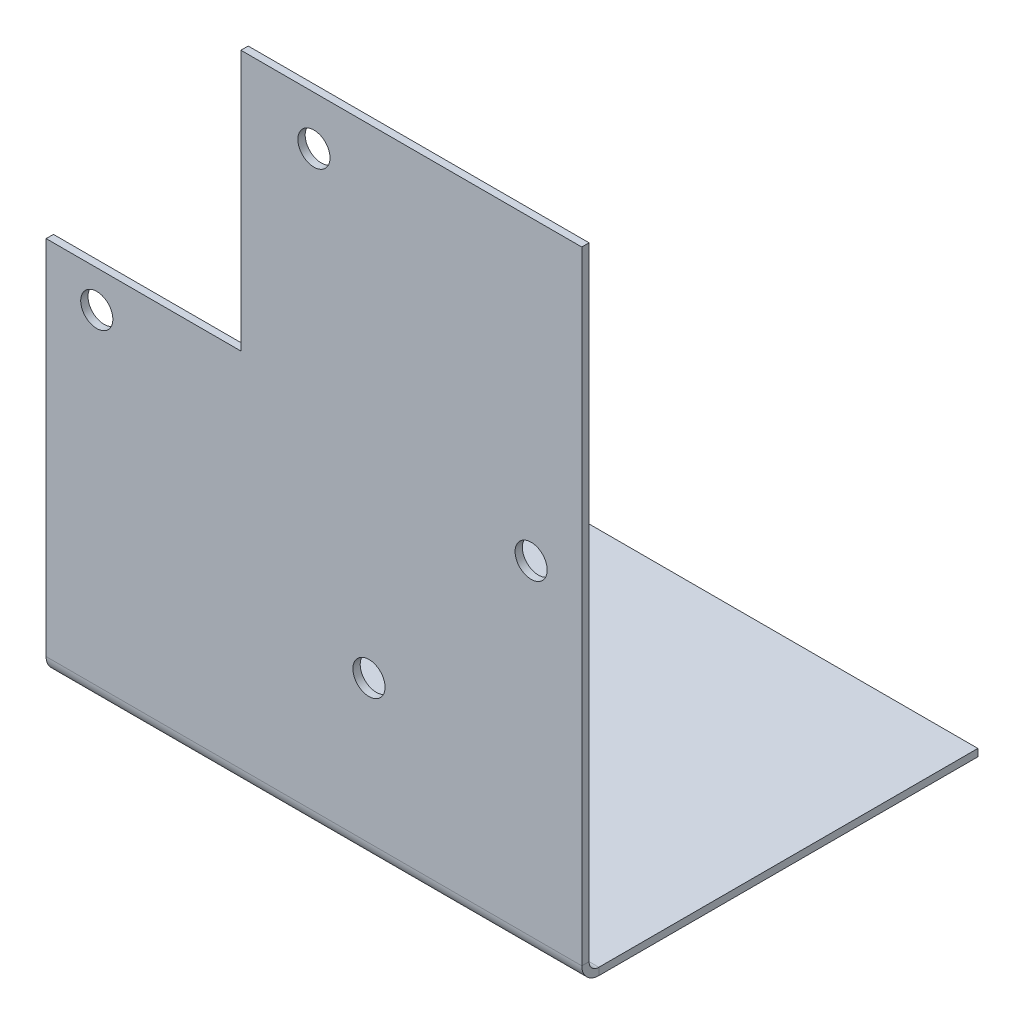
ISO-10303-21;
HEADER;
FILE_DESCRIPTION(('STEP AP214'),'2;1');
FILE_NAME('part.step','',(''),(''),'','','');
FILE_SCHEMA(('AUTOMOTIVE_DESIGN { 1 0 10303 214 1 1 1 1 }'));
ENDSEC;
DATA;
#1=APPLICATION_CONTEXT('core data for automotive mechanical design processes');
#2=APPLICATION_PROTOCOL_DEFINITION('international standard','automotive_design',2000,#1);
#3=PRODUCT_CONTEXT('',#1,'mechanical');
#4=PRODUCT('Part','Part','',(#3));
#5=PRODUCT_RELATED_PRODUCT_CATEGORY('part','',(#4));
#6=PRODUCT_DEFINITION_FORMATION('','',#4);
#7=PRODUCT_DEFINITION_CONTEXT('part definition',#1,'design');
#8=PRODUCT_DEFINITION('design','',#6,#7);
#9=PRODUCT_DEFINITION_SHAPE('','',#8);
#10=(LENGTH_UNIT() NAMED_UNIT(*) SI_UNIT(.MILLI.,.METRE.));
#11=(NAMED_UNIT(*) PLANE_ANGLE_UNIT() SI_UNIT($,.RADIAN.));
#12=(NAMED_UNIT(*) SI_UNIT($,.STERADIAN.) SOLID_ANGLE_UNIT());
#13=UNCERTAINTY_MEASURE_WITH_UNIT(LENGTH_MEASURE(1.E-05),#10,'distance_accuracy_value','');
#14=(GEOMETRIC_REPRESENTATION_CONTEXT(3) GLOBAL_UNCERTAINTY_ASSIGNED_CONTEXT((#13)) GLOBAL_UNIT_ASSIGNED_CONTEXT((#10,
#11,#12)) REPRESENTATION_CONTEXT('',''));
#15=CARTESIAN_POINT('',(0.,0.,0.));
#16=DIRECTION('',(0.,0.,1.));
#17=DIRECTION('',(1.,0.,0.));
#18=AXIS2_PLACEMENT_3D('',#15,#16,#17);
#19=CARTESIAN_POINT('',(-55.,-26.3401550506575,130.159844949343));
#20=DIRECTION('',(-1.,0.,0.));
#21=DIRECTION('',(0.,0.,-1.));
#22=AXIS2_PLACEMENT_3D('',#19,#20,#21);
#23=PLANE('',#22);
#24=DIRECTION('',(0.,0.,-1.));
#25=VECTOR('',#24,1.);
#26=CARTESIAN_POINT('',(-55.,-26.3401550506575,130.159844949343));
#27=LINE('',#26,#25);
#28=CARTESIAN_POINT('',(-55.,-26.340155050657,-2.00000000000001));
#29=VERTEX_POINT('',#28);
#30=CARTESIAN_POINT('',(-55.,-26.3401550506567,-79.840155050657));
#31=VERTEX_POINT('',#30);
#32=EDGE_CURVE('E171',#29,#31,#27,.T.);
#33=ORIENTED_EDGE('',*,*,#32,.F.);
#34=DIRECTION('',(0.,1.,0.));
#35=VECTOR('',#34,1.);
#36=CARTESIAN_POINT('',(-55.,-26.3401550506561,-2.00000000000001));
#37=LINE('',#36,#35);
#38=CARTESIAN_POINT('',(-55.,-24.840155050657,-2.00000000000001));
#39=VERTEX_POINT('',#38);
#40=EDGE_CURVE('E12',#29,#39,#37,.T.);
#41=ORIENTED_EDGE('',*,*,#40,.T.);
#42=DIRECTION('',(0.,0.,1.));
#43=VECTOR('',#42,1.);
#44=CARTESIAN_POINT('',(-55.,-24.8401550506571,25.159844949343));
#45=LINE('',#44,#43);
#46=CARTESIAN_POINT('',(-55.,-24.8401550506567,-79.840155050657));
#47=VERTEX_POINT('',#46);
#48=EDGE_CURVE('E83',#39,#47,#45,.F.);
#49=ORIENTED_EDGE('',*,*,#48,.T.);
#50=DIRECTION('',(0.,-1.,0.));
#51=VECTOR('',#50,1.);
#52=CARTESIAN_POINT('',(-55.,-26.3401550506567,-79.840155050657));
#53=LINE('',#52,#51);
#54=EDGE_CURVE('E172',#47,#31,#53,.T.);
#55=ORIENTED_EDGE('',*,*,#54,.T.);
#56=EDGE_LOOP('',(#33,#41,#49,#55));
#57=FACE_BOUND('',#56,.T.);
#58=ADVANCED_FACE('F45',(#57),#23,.T.);
#59=CARTESIAN_POINT('',(55.,-26.3401550506575,130.159844949343));
#60=DIRECTION('',(1.,0.,0.));
#61=DIRECTION('',(0.,0.,1.));
#62=AXIS2_PLACEMENT_3D('',#59,#60,#61);
#63=PLANE('',#62);
#64=DIRECTION('',(0.,0.,1.));
#65=VECTOR('',#64,1.);
#66=CARTESIAN_POINT('',(55.,-24.8401550506571,25.159844949343));
#67=LINE('',#66,#65);
#68=CARTESIAN_POINT('',(55.,-24.8401550506567,-79.840155050657));
#69=VERTEX_POINT('',#68);
#70=CARTESIAN_POINT('',(54.9999999999999,-24.840155050657,-2.00000000000001));
#71=VERTEX_POINT('',#70);
#72=EDGE_CURVE('E175',#69,#71,#67,.T.);
#73=ORIENTED_EDGE('',*,*,#72,.T.);
#74=DIRECTION('',(0.,-1.,0.));
#75=VECTOR('',#74,1.);
#76=CARTESIAN_POINT('',(55.,-26.3401550506561,-2.00000000000001));
#77=LINE('',#76,#75);
#78=CARTESIAN_POINT('',(55.,-26.340155050657,-2.00000000000001));
#79=VERTEX_POINT('',#78);
#80=EDGE_CURVE('E143',#71,#79,#77,.T.);
#81=ORIENTED_EDGE('',*,*,#80,.T.);
#82=DIRECTION('',(0.,0.,1.));
#83=VECTOR('',#82,1.);
#84=CARTESIAN_POINT('',(55.,-26.3401550506575,130.159844949343));
#85=LINE('',#84,#83);
#86=CARTESIAN_POINT('',(55.,-26.3401550506567,-79.840155050657));
#87=VERTEX_POINT('',#86);
#88=EDGE_CURVE('E48',#87,#79,#85,.T.);
#89=ORIENTED_EDGE('',*,*,#88,.F.);
#90=DIRECTION('',(0.,-1.,0.));
#91=VECTOR('',#90,1.);
#92=CARTESIAN_POINT('',(55.,-26.3401550506567,-79.840155050657));
#93=LINE('',#92,#91);
#94=EDGE_CURVE('E70',#69,#87,#93,.T.);
#95=ORIENTED_EDGE('',*,*,#94,.F.);
#96=EDGE_LOOP('',(#73,#81,#89,#95));
#97=FACE_BOUND('',#96,.T.);
#98=ADVANCED_FACE('F257',(#97),#63,.T.);
#99=CARTESIAN_POINT('',(0.,-26.3401550506571,25.159844949343));
#100=DIRECTION('',(0.,-1.,0.));
#101=DIRECTION('',(1.,0.,0.));
#102=AXIS2_PLACEMENT_3D('',#99,#100,#101);
#103=PLANE('',#102);
#104=ORIENTED_EDGE('',*,*,#88,.T.);
#105=DIRECTION('',(-1.,0.,0.));
#106=VECTOR('',#105,1.);
#107=CARTESIAN_POINT('',(0.,-26.340155050657,-2.00000000000003));
#108=LINE('',#107,#106);
#109=EDGE_CURVE('E180',#79,#29,#108,.T.);
#110=ORIENTED_EDGE('',*,*,#109,.T.);
#111=ORIENTED_EDGE('',*,*,#32,.T.);
#112=DIRECTION('',(1.,0.,0.));
#113=VECTOR('',#112,1.);
#114=CARTESIAN_POINT('',(-55.,-26.3401550506567,-79.840155050657));
#115=LINE('',#114,#113);
#116=EDGE_CURVE('E174',#31,#87,#115,.T.);
#117=ORIENTED_EDGE('',*,*,#116,.T.);
#118=EDGE_LOOP('',(#104,#110,#111,#117));
#119=FACE_BOUND('',#118,.T.);
#120=ADVANCED_FACE('F255',(#119),#103,.T.);
#121=CARTESIAN_POINT('',(-55.,-26.3401550506567,-79.840155050657));
#122=DIRECTION('',(0.,0.,-1.));
#123=DIRECTION('',(1.,0.,0.));
#124=AXIS2_PLACEMENT_3D('',#121,#122,#123);
#125=PLANE('',#124);
#126=ORIENTED_EDGE('',*,*,#54,.F.);
#127=DIRECTION('',(1.,0.,0.));
#128=VECTOR('',#127,1.);
#129=CARTESIAN_POINT('',(0.,-24.8401550506567,-79.840155050657));
#130=LINE('',#129,#128);
#131=EDGE_CURVE('E167',#47,#69,#130,.T.);
#132=ORIENTED_EDGE('',*,*,#131,.T.);
#133=ORIENTED_EDGE('',*,*,#94,.T.);
#134=ORIENTED_EDGE('',*,*,#116,.F.);
#135=EDGE_LOOP('',(#126,#132,#133,#134));
#136=FACE_BOUND('',#135,.T.);
#137=ADVANCED_FACE('F258',(#136),#125,.T.);
#138=CARTESIAN_POINT('',(0.,-24.8401550506571,25.159844949343));
#139=DIRECTION('',(0.,-1.,0.));
#140=DIRECTION('',(1.,0.,0.));
#141=AXIS2_PLACEMENT_3D('',#138,#139,#140);
#142=PLANE('',#141);
#143=DIRECTION('',(-1.,0.,0.));
#144=VECTOR('',#143,1.);
#145=CARTESIAN_POINT('',(0.,-24.840155050657,-2.00000000000001));
#146=LINE('',#145,#144);
#147=EDGE_CURVE('E53',#71,#39,#146,.T.);
#148=ORIENTED_EDGE('',*,*,#147,.F.);
#149=ORIENTED_EDGE('',*,*,#72,.F.);
#150=ORIENTED_EDGE('',*,*,#131,.F.);
#151=ORIENTED_EDGE('',*,*,#48,.F.);
#152=EDGE_LOOP('',(#148,#149,#150,#151));
#153=FACE_BOUND('',#152,.T.);
#154=ADVANCED_FACE('F166',(#153),#142,.F.);
#155=CARTESIAN_POINT('',(11.3,6.50000000000001,1.5));
#156=DIRECTION('',(0.,0.,1.));
#157=DIRECTION('',(1.,0.,0.));
#158=AXIS2_PLACEMENT_3D('',#155,#156,#157);
#159=CYLINDRICAL_SURFACE('',#158,3.3);
#160=CARTESIAN_POINT('',(11.3,6.50000000000001,1.5));
#161=DIRECTION('',(0.,0.,1.));
#162=DIRECTION('',(1.,0.,0.));
#163=AXIS2_PLACEMENT_3D('',#160,#161,#162);
#164=CIRCLE('',#163,3.3);
#165=CARTESIAN_POINT('',(14.6,6.50000000000001,1.5));
#166=VERTEX_POINT('',#165);
#167=EDGE_CURVE('E191',#166,#166,#164,.T.);
#168=ORIENTED_EDGE('',*,*,#167,.T.);
#169=EDGE_LOOP('',(#168));
#170=FACE_BOUND('',#169,.T.);
#171=CARTESIAN_POINT('',(11.3,6.50000000000001,0.));
#172=DIRECTION('',(0.,0.,1.));
#173=DIRECTION('',(1.,0.,0.));
#174=AXIS2_PLACEMENT_3D('',#171,#172,#173);
#175=CIRCLE('',#174,3.3);
#176=CARTESIAN_POINT('',(14.6,6.50000000000001,0.));
#177=VERTEX_POINT('',#176);
#178=EDGE_CURVE('E226',#177,#177,#175,.T.);
#179=ORIENTED_EDGE('',*,*,#178,.F.);
#180=EDGE_LOOP('',(#179));
#181=FACE_BOUND('',#180,.T.);
#182=ADVANCED_FACE('F265',(#170,#181),#159,.F.);
#183=CARTESIAN_POINT('',(44.6,44.,1.5));
#184=DIRECTION('',(0.,0.,1.));
#185=DIRECTION('',(1.,0.,0.));
#186=AXIS2_PLACEMENT_3D('',#183,#184,#185);
#187=CYLINDRICAL_SURFACE('',#186,3.3);
#188=CARTESIAN_POINT('',(44.6,44.,1.5));
#189=DIRECTION('',(0.,0.,1.));
#190=DIRECTION('',(1.,0.,0.));
#191=AXIS2_PLACEMENT_3D('',#188,#189,#190);
#192=CIRCLE('',#191,3.3);
#193=CARTESIAN_POINT('',(47.9,44.,1.5));
#194=VERTEX_POINT('',#193);
#195=EDGE_CURVE('E194',#194,#194,#192,.T.);
#196=ORIENTED_EDGE('',*,*,#195,.T.);
#197=EDGE_LOOP('',(#196));
#198=FACE_BOUND('',#197,.T.);
#199=CARTESIAN_POINT('',(44.6,44.,0.));
#200=DIRECTION('',(0.,0.,1.));
#201=DIRECTION('',(1.,0.,0.));
#202=AXIS2_PLACEMENT_3D('',#199,#200,#201);
#203=CIRCLE('',#202,3.3);
#204=CARTESIAN_POINT('',(47.9,44.,0.));
#205=VERTEX_POINT('',#204);
#206=EDGE_CURVE('E229',#205,#205,#203,.T.);
#207=ORIENTED_EDGE('',*,*,#206,.F.);
#208=EDGE_LOOP('',(#207));
#209=FACE_BOUND('',#208,.T.);
#210=ADVANCED_FACE('F304',(#198,#209),#187,.F.);
#211=CARTESIAN_POINT('',(-44.6,44.,1.5));
#212=DIRECTION('',(0.,0.,1.));
#213=DIRECTION('',(1.,0.,0.));
#214=AXIS2_PLACEMENT_3D('',#211,#212,#213);
#215=CYLINDRICAL_SURFACE('',#214,3.3);
#216=CARTESIAN_POINT('',(-44.6,44.,1.5));
#217=DIRECTION('',(0.,0.,1.));
#218=DIRECTION('',(1.,0.,0.));
#219=AXIS2_PLACEMENT_3D('',#216,#217,#218);
#220=CIRCLE('',#219,3.3);
#221=CARTESIAN_POINT('',(-41.3,44.,1.5));
#222=VERTEX_POINT('',#221);
#223=EDGE_CURVE('E197',#222,#222,#220,.T.);
#224=ORIENTED_EDGE('',*,*,#223,.T.);
#225=EDGE_LOOP('',(#224));
#226=FACE_BOUND('',#225,.T.);
#227=CARTESIAN_POINT('',(-44.6,44.,0.));
#228=DIRECTION('',(0.,0.,1.));
#229=DIRECTION('',(1.,0.,0.));
#230=AXIS2_PLACEMENT_3D('',#227,#228,#229);
#231=CIRCLE('',#230,3.3);
#232=CARTESIAN_POINT('',(-41.3,44.,0.));
#233=VERTEX_POINT('',#232);
#234=EDGE_CURVE('E232',#233,#233,#231,.T.);
#235=ORIENTED_EDGE('',*,*,#234,.F.);
#236=EDGE_LOOP('',(#235));
#237=FACE_BOUND('',#236,.T.);
#238=ADVANCED_FACE('F316',(#226,#237),#215,.F.);
#239=CARTESIAN_POINT('',(0.,95.,1.5));
#240=DIRECTION('',(0.,0.,1.));
#241=DIRECTION('',(1.,0.,0.));
#242=AXIS2_PLACEMENT_3D('',#239,#240,#241);
#243=CYLINDRICAL_SURFACE('',#242,3.3);
#244=CARTESIAN_POINT('',(0.,95.,1.5));
#245=DIRECTION('',(0.,0.,1.));
#246=DIRECTION('',(1.,0.,0.));
#247=AXIS2_PLACEMENT_3D('',#244,#245,#246);
#248=CIRCLE('',#247,3.3);
#249=CARTESIAN_POINT('',(3.3,95.,1.5));
#250=VERTEX_POINT('',#249);
#251=EDGE_CURVE('E200',#250,#250,#248,.T.);
#252=ORIENTED_EDGE('',*,*,#251,.T.);
#253=EDGE_LOOP('',(#252));
#254=FACE_BOUND('',#253,.T.);
#255=CARTESIAN_POINT('',(0.,95.,0.));
#256=DIRECTION('',(0.,0.,1.));
#257=DIRECTION('',(1.,0.,0.));
#258=AXIS2_PLACEMENT_3D('',#255,#256,#257);
#259=CIRCLE('',#258,3.3);
#260=CARTESIAN_POINT('',(3.3,95.,0.));
#261=VERTEX_POINT('',#260);
#262=EDGE_CURVE('E235',#261,#261,#259,.T.);
#263=ORIENTED_EDGE('',*,*,#262,.F.);
#264=EDGE_LOOP('',(#263));
#265=FACE_BOUND('',#264,.T.);
#266=ADVANCED_FACE('F327',(#254,#265),#243,.F.);
#267=CARTESIAN_POINT('',(-55.,51.5,1.5));
#268=DIRECTION('',(0.,-1.,0.));
#269=DIRECTION('',(1.,0.,0.));
#270=AXIS2_PLACEMENT_3D('',#267,#268,#269);
#271=PLANE('',#270);
#272=DIRECTION('',(1.,0.,0.));
#273=VECTOR('',#272,1.);
#274=CARTESIAN_POINT('',(0.,51.5,0.));
#275=LINE('',#274,#273);
#276=CARTESIAN_POINT('',(-55.,51.5,0.));
#277=VERTEX_POINT('',#276);
#278=CARTESIAN_POINT('',(-15.,51.5,0.));
#279=VERTEX_POINT('',#278);
#280=EDGE_CURVE('E241',#277,#279,#275,.T.);
#281=ORIENTED_EDGE('',*,*,#280,.F.);
#282=DIRECTION('',(0.,0.,1.));
#283=VECTOR('',#282,1.);
#284=CARTESIAN_POINT('',(-55.,51.5,1.5));
#285=LINE('',#284,#283);
#286=CARTESIAN_POINT('',(-55.,51.5,1.5));
#287=VERTEX_POINT('',#286);
#288=EDGE_CURVE('E92',#277,#287,#285,.T.);
#289=ORIENTED_EDGE('',*,*,#288,.T.);
#290=DIRECTION('',(1.,0.,0.));
#291=VECTOR('',#290,1.);
#292=CARTESIAN_POINT('',(-55.,51.5,1.5));
#293=LINE('',#292,#291);
#294=CARTESIAN_POINT('',(-15.,51.5,1.5));
#295=VERTEX_POINT('',#294);
#296=EDGE_CURVE('E204',#287,#295,#293,.T.);
#297=ORIENTED_EDGE('',*,*,#296,.T.);
#298=DIRECTION('',(0.,0.,1.));
#299=VECTOR('',#298,1.);
#300=CARTESIAN_POINT('',(-15.,51.5,1.5));
#301=LINE('',#300,#299);
#302=EDGE_CURVE('E207',#279,#295,#301,.T.);
#303=ORIENTED_EDGE('',*,*,#302,.F.);
#304=EDGE_LOOP('',(#281,#289,#297,#303));
#305=FACE_BOUND('',#304,.T.);
#306=ADVANCED_FACE('F338',(#305),#271,.F.);
#307=CARTESIAN_POINT('',(-15.,51.5,1.5));
#308=DIRECTION('',(1.,0.,0.));
#309=DIRECTION('',(0.,1.,0.));
#310=AXIS2_PLACEMENT_3D('',#307,#308,#309);
#311=PLANE('',#310);
#312=DIRECTION('',(0.,0.,1.));
#313=VECTOR('',#312,1.);
#314=CARTESIAN_POINT('',(-15.,105.,1.5));
#315=LINE('',#314,#313);
#316=CARTESIAN_POINT('',(-15.,105.,0.));
#317=VERTEX_POINT('',#316);
#318=CARTESIAN_POINT('',(-15.,105.,1.5));
#319=VERTEX_POINT('',#318);
#320=EDGE_CURVE('E215',#317,#319,#315,.T.);
#321=ORIENTED_EDGE('',*,*,#320,.F.);
#322=DIRECTION('',(0.,1.,0.));
#323=VECTOR('',#322,1.);
#324=CARTESIAN_POINT('',(-15.,0.,0.));
#325=LINE('',#324,#323);
#326=EDGE_CURVE('E244',#279,#317,#325,.T.);
#327=ORIENTED_EDGE('',*,*,#326,.F.);
#328=ORIENTED_EDGE('',*,*,#302,.T.);
#329=DIRECTION('',(0.,1.,0.));
#330=VECTOR('',#329,1.);
#331=CARTESIAN_POINT('',(-15.,51.5,1.5));
#332=LINE('',#331,#330);
#333=EDGE_CURVE('E209',#295,#319,#332,.T.);
#334=ORIENTED_EDGE('',*,*,#333,.T.);
#335=EDGE_LOOP('',(#321,#327,#328,#334));
#336=FACE_BOUND('',#335,.T.);
#337=ADVANCED_FACE('F349',(#336),#311,.F.);
#338=CARTESIAN_POINT('',(-55.,105.,1.5));
#339=DIRECTION('',(0.,1.,0.));
#340=DIRECTION('',(-1.,0.,0.));
#341=AXIS2_PLACEMENT_3D('',#338,#339,#340);
#342=PLANE('',#341);
#343=DIRECTION('',(0.,0.,1.));
#344=VECTOR('',#343,1.);
#345=CARTESIAN_POINT('',(55.,105.,1.5));
#346=LINE('',#345,#344);
#347=CARTESIAN_POINT('',(55.,105.,0.));
#348=VERTEX_POINT('',#347);
#349=CARTESIAN_POINT('',(55.,105.,1.5));
#350=VERTEX_POINT('',#349);
#351=EDGE_CURVE('E224',#348,#350,#346,.T.);
#352=ORIENTED_EDGE('',*,*,#351,.F.);
#353=DIRECTION('',(1.,0.,0.));
#354=VECTOR('',#353,1.);
#355=CARTESIAN_POINT('',(0.,105.,0.));
#356=LINE('',#355,#354);
#357=EDGE_CURVE('E212',#348,#317,#356,.F.);
#358=ORIENTED_EDGE('',*,*,#357,.T.);
#359=ORIENTED_EDGE('',*,*,#320,.T.);
#360=DIRECTION('',(-1.,0.,0.));
#361=VECTOR('',#360,1.);
#362=CARTESIAN_POINT('',(-55.,105.,1.5));
#363=LINE('',#362,#361);
#364=EDGE_CURVE('E218',#350,#319,#363,.T.);
#365=ORIENTED_EDGE('',*,*,#364,.F.);
#366=EDGE_LOOP('',(#352,#358,#359,#365));
#367=FACE_BOUND('',#366,.T.);
#368=ADVANCED_FACE('F360',(#367),#342,.T.);
#369=CARTESIAN_POINT('',(0.,0.,1.5));
#370=DIRECTION('',(0.,0.,1.));
#371=DIRECTION('',(1.,0.,0.));
#372=AXIS2_PLACEMENT_3D('',#369,#370,#371);
#373=PLANE('',#372);
#374=DIRECTION('',(-1.,0.,0.));
#375=VECTOR('',#374,1.);
#376=CARTESIAN_POINT('',(0.,-22.840155050657,1.5));
#377=LINE('',#376,#375);
#378=CARTESIAN_POINT('',(55.,-22.840155050657,1.5));
#379=VERTEX_POINT('',#378);
#380=CARTESIAN_POINT('',(-55.,-22.840155050657,1.5));
#381=VERTEX_POINT('',#380);
#382=EDGE_CURVE('E185',#379,#381,#377,.T.);
#383=ORIENTED_EDGE('',*,*,#382,.F.);
#384=DIRECTION('',(0.,1.,0.));
#385=VECTOR('',#384,1.);
#386=CARTESIAN_POINT('',(55.,105.,1.5));
#387=LINE('',#386,#385);
#388=EDGE_CURVE('E135',#379,#350,#387,.T.);
#389=ORIENTED_EDGE('',*,*,#388,.T.);
#390=ORIENTED_EDGE('',*,*,#364,.T.);
#391=ORIENTED_EDGE('',*,*,#333,.F.);
#392=ORIENTED_EDGE('',*,*,#296,.F.);
#393=DIRECTION('',(0.,-1.,0.));
#394=VECTOR('',#393,1.);
#395=CARTESIAN_POINT('',(-55.,105.,1.5));
#396=LINE('',#395,#394);
#397=EDGE_CURVE('E127',#287,#381,#396,.T.);
#398=ORIENTED_EDGE('',*,*,#397,.T.);
#399=EDGE_LOOP('',(#383,#389,#390,#391,#392,#398));
#400=FACE_BOUND('',#399,.T.);
#401=ORIENTED_EDGE('',*,*,#251,.F.);
#402=EDGE_LOOP('',(#401));
#403=FACE_BOUND('',#402,.T.);
#404=ORIENTED_EDGE('',*,*,#223,.F.);
#405=EDGE_LOOP('',(#404));
#406=FACE_BOUND('',#405,.T.);
#407=ORIENTED_EDGE('',*,*,#195,.F.);
#408=EDGE_LOOP('',(#407));
#409=FACE_BOUND('',#408,.T.);
#410=ORIENTED_EDGE('',*,*,#167,.F.);
#411=EDGE_LOOP('',(#410));
#412=FACE_BOUND('',#411,.T.);
#413=ADVANCED_FACE('F371',(#400,#403,#406,#409,#412),#373,.T.);
#414=CARTESIAN_POINT('',(55.,105.,1.5));
#415=DIRECTION('',(1.,0.,0.));
#416=DIRECTION('',(0.,1.,0.));
#417=AXIS2_PLACEMENT_3D('',#414,#415,#416);
#418=PLANE('',#417);
#419=DIRECTION('',(0.,0.,1.));
#420=VECTOR('',#419,1.);
#421=CARTESIAN_POINT('',(55.,-22.840155050657,1.49999999999911));
#422=LINE('',#421,#420);
#423=CARTESIAN_POINT('',(55.,-22.840155050657,0.));
#424=VERTEX_POINT('',#423);
#425=EDGE_CURVE('E188',#424,#379,#422,.T.);
#426=ORIENTED_EDGE('',*,*,#425,.F.);
#427=DIRECTION('',(0.,1.,0.));
#428=VECTOR('',#427,1.);
#429=CARTESIAN_POINT('',(55.,0.,0.));
#430=LINE('',#429,#428);
#431=EDGE_CURVE('E222',#424,#348,#430,.T.);
#432=ORIENTED_EDGE('',*,*,#431,.T.);
#433=ORIENTED_EDGE('',*,*,#351,.T.);
#434=ORIENTED_EDGE('',*,*,#388,.F.);
#435=EDGE_LOOP('',(#426,#432,#433,#434));
#436=FACE_BOUND('',#435,.T.);
#437=ADVANCED_FACE('F382',(#436),#418,.T.);
#438=CARTESIAN_POINT('',(0.,0.,0.));
#439=DIRECTION('',(0.,0.,1.));
#440=DIRECTION('',(1.,0.,0.));
#441=AXIS2_PLACEMENT_3D('',#438,#439,#440);
#442=PLANE('',#441);
#443=ORIENTED_EDGE('',*,*,#178,.T.);
#444=EDGE_LOOP('',(#443));
#445=FACE_BOUND('',#444,.T.);
#446=ORIENTED_EDGE('',*,*,#206,.T.);
#447=EDGE_LOOP('',(#446));
#448=FACE_BOUND('',#447,.T.);
#449=ORIENTED_EDGE('',*,*,#234,.T.);
#450=EDGE_LOOP('',(#449));
#451=FACE_BOUND('',#450,.T.);
#452=ORIENTED_EDGE('',*,*,#262,.T.);
#453=EDGE_LOOP('',(#452));
#454=FACE_BOUND('',#453,.T.);
#455=ORIENTED_EDGE('',*,*,#431,.F.);
#456=DIRECTION('',(-1.,0.,0.));
#457=VECTOR('',#456,1.);
#458=CARTESIAN_POINT('',(0.,-22.840155050657,0.));
#459=LINE('',#458,#457);
#460=CARTESIAN_POINT('',(-55.,-22.840155050657,0.));
#461=VERTEX_POINT('',#460);
#462=EDGE_CURVE('E238',#424,#461,#459,.T.);
#463=ORIENTED_EDGE('',*,*,#462,.T.);
#464=DIRECTION('',(0.,1.,0.));
#465=VECTOR('',#464,1.);
#466=CARTESIAN_POINT('',(-55.,0.,0.));
#467=LINE('',#466,#465);
#468=EDGE_CURVE('E168',#277,#461,#467,.F.);
#469=ORIENTED_EDGE('',*,*,#468,.F.);
#470=ORIENTED_EDGE('',*,*,#280,.T.);
#471=ORIENTED_EDGE('',*,*,#326,.T.);
#472=ORIENTED_EDGE('',*,*,#357,.F.);
#473=EDGE_LOOP('',(#455,#463,#469,#470,#471,#472));
#474=FACE_BOUND('',#473,.T.);
#475=ADVANCED_FACE('F392',(#445,#448,#451,#454,#474),#442,.F.);
#476=CARTESIAN_POINT('',(-55.,105.,1.5));
#477=DIRECTION('',(-1.,0.,0.));
#478=DIRECTION('',(0.,-1.,0.));
#479=AXIS2_PLACEMENT_3D('',#476,#477,#478);
#480=PLANE('',#479);
#481=DIRECTION('',(0.,0.,-1.));
#482=VECTOR('',#481,1.);
#483=CARTESIAN_POINT('',(-55.,-22.840155050657,1.49999999999911));
#484=LINE('',#483,#482);
#485=EDGE_CURVE('E162',#381,#461,#484,.T.);
#486=ORIENTED_EDGE('',*,*,#485,.F.);
#487=ORIENTED_EDGE('',*,*,#397,.F.);
#488=ORIENTED_EDGE('',*,*,#288,.F.);
#489=ORIENTED_EDGE('',*,*,#468,.T.);
#490=EDGE_LOOP('',(#486,#487,#488,#489));
#491=FACE_BOUND('',#490,.T.);
#492=ADVANCED_FACE('F402',(#491),#480,.T.);
#493=CARTESIAN_POINT('',(55.,-22.840155050657,-2.));
#494=DIRECTION('',(1.,0.,0.));
#495=DIRECTION('',(0.,0.,-1.));
#496=AXIS2_PLACEMENT_3D('',#493,#494,#495);
#497=PLANE('',#496);
#498=ORIENTED_EDGE('',*,*,#80,.F.);
#499=CARTESIAN_POINT('',(54.9999999999999,-22.840155050657,-2.));
#500=DIRECTION('',(1.,0.,0.));
#501=DIRECTION('',(0.,0.,-1.));
#502=AXIS2_PLACEMENT_3D('',#499,#500,#501);
#503=CIRCLE('',#502,2.);
#504=EDGE_CURVE('E153',#71,#424,#503,.F.);
#505=ORIENTED_EDGE('',*,*,#504,.T.);
#506=ORIENTED_EDGE('',*,*,#425,.T.);
#507=CARTESIAN_POINT('',(55.,-22.840155050657,-2.));
#508=DIRECTION('',(-1.,0.,0.));
#509=DIRECTION('',(0.,0.,1.));
#510=AXIS2_PLACEMENT_3D('',#507,#508,#509);
#511=CIRCLE('',#510,3.5);
#512=EDGE_CURVE('E163',#79,#379,#511,.T.);
#513=ORIENTED_EDGE('',*,*,#512,.F.);
#514=EDGE_LOOP('',(#498,#505,#506,#513));
#515=FACE_BOUND('',#514,.T.);
#516=ADVANCED_FACE('F253',(#515),#497,.T.);
#517=CARTESIAN_POINT('',(-55.,-22.840155050657,-2.));
#518=DIRECTION('',(-1.,0.,0.));
#519=DIRECTION('',(0.,0.,1.));
#520=AXIS2_PLACEMENT_3D('',#517,#518,#519);
#521=PLANE('',#520);
#522=CARTESIAN_POINT('',(-55.,-22.840155050657,-2.));
#523=DIRECTION('',(1.,0.,0.));
#524=DIRECTION('',(0.,0.,-1.));
#525=AXIS2_PLACEMENT_3D('',#522,#523,#524);
#526=CIRCLE('',#525,2.);
#527=EDGE_CURVE('E152',#461,#39,#526,.T.);
#528=ORIENTED_EDGE('',*,*,#527,.T.);
#529=ORIENTED_EDGE('',*,*,#40,.F.);
#530=CARTESIAN_POINT('',(-55.,-22.840155050657,-2.));
#531=DIRECTION('',(1.,0.,0.));
#532=DIRECTION('',(0.,0.,-1.));
#533=AXIS2_PLACEMENT_3D('',#530,#531,#532);
#534=CIRCLE('',#533,3.5);
#535=EDGE_CURVE('E61',#381,#29,#534,.T.);
#536=ORIENTED_EDGE('',*,*,#535,.F.);
#537=ORIENTED_EDGE('',*,*,#485,.T.);
#538=EDGE_LOOP('',(#528,#529,#536,#537));
#539=FACE_BOUND('',#538,.T.);
#540=ADVANCED_FACE('F160',(#539),#521,.T.);
#541=CARTESIAN_POINT('',(-110.095003160093,-22.840155050657,-2.));
#542=DIRECTION('',(1.,0.,0.));
#543=DIRECTION('',(0.,0.,-1.));
#544=AXIS2_PLACEMENT_3D('',#541,#542,#543);
#545=CYLINDRICAL_SURFACE('',#544,3.5);
#546=ORIENTED_EDGE('',*,*,#382,.T.);
#547=ORIENTED_EDGE('',*,*,#535,.T.);
#548=ORIENTED_EDGE('',*,*,#109,.F.);
#549=ORIENTED_EDGE('',*,*,#512,.T.);
#550=EDGE_LOOP('',(#546,#547,#548,#549));
#551=FACE_BOUND('',#550,.T.);
#552=ADVANCED_FACE('F251',(#551),#545,.T.);
#553=CARTESIAN_POINT('',(-110.095003160093,-22.840155050657,-2.));
#554=DIRECTION('',(1.,0.,0.));
#555=DIRECTION('',(0.,0.,-1.));
#556=AXIS2_PLACEMENT_3D('',#553,#554,#555);
#557=CYLINDRICAL_SURFACE('',#556,2.);
#558=ORIENTED_EDGE('',*,*,#462,.F.);
#559=ORIENTED_EDGE('',*,*,#504,.F.);
#560=ORIENTED_EDGE('',*,*,#147,.T.);
#561=ORIENTED_EDGE('',*,*,#527,.F.);
#562=EDGE_LOOP('',(#558,#559,#560,#561));
#563=FACE_BOUND('',#562,.T.);
#564=ADVANCED_FACE('F151',(#563),#557,.F.);
#565=CLOSED_SHELL('',(#58,#98,#120,#137,#154,#182,#210,#238,#266,#306,#337,#368,#413,#437,#475,
#492,#516,#540,#552,#564));
#566=MANIFOLD_SOLID_BREP('B2',#565);
#567=ADVANCED_BREP_SHAPE_REPRESENTATION('',(#18,#566),#14);
#568=SHAPE_DEFINITION_REPRESENTATION(#9,#567);
ENDSEC;
END-ISO-10303-21;
